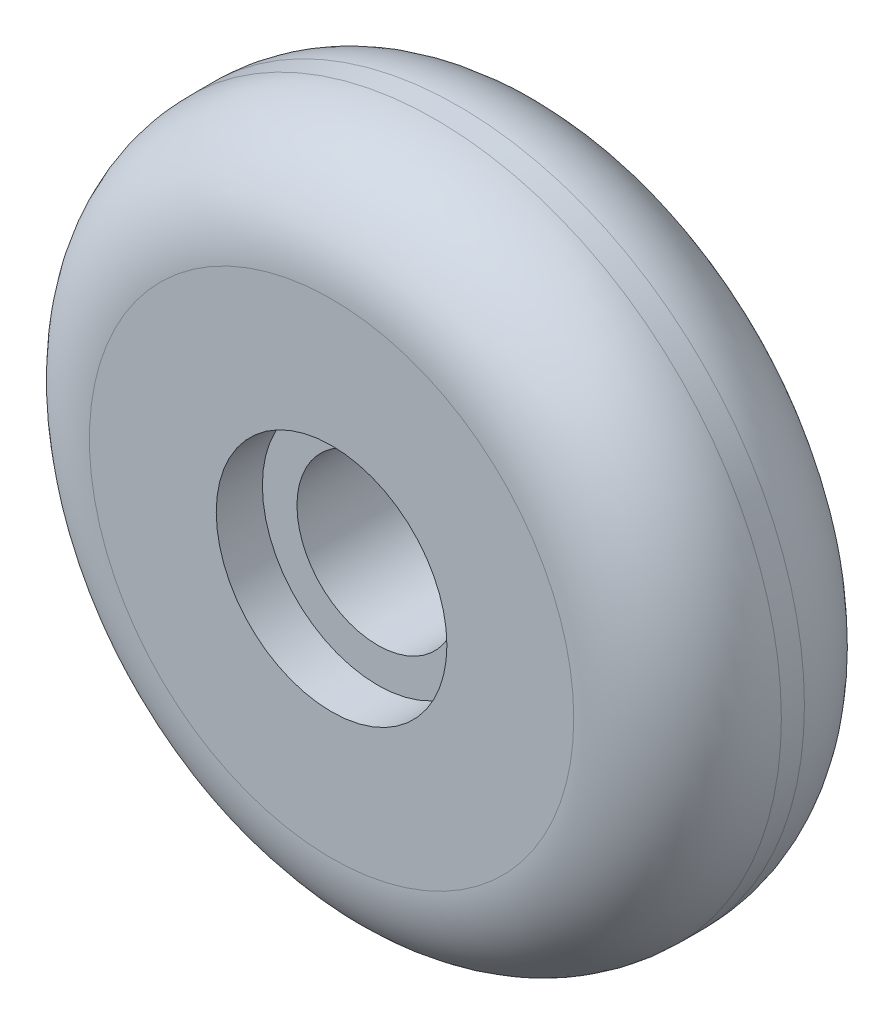
ISO-10303-21;
HEADER;
FILE_DESCRIPTION(('STEP AP214'),'2;1');
FILE_NAME('part.step','',(''),(''),'','','');
FILE_SCHEMA(('AUTOMOTIVE_DESIGN { 1 0 10303 214 1 1 1 1 }'));
ENDSEC;
DATA;
#1=APPLICATION_CONTEXT('core data for automotive mechanical design processes');
#2=APPLICATION_PROTOCOL_DEFINITION('international standard','automotive_design',2000,#1);
#3=PRODUCT_CONTEXT('',#1,'mechanical');
#4=PRODUCT('Part','Part','',(#3));
#5=PRODUCT_RELATED_PRODUCT_CATEGORY('part','',(#4));
#6=PRODUCT_DEFINITION_FORMATION('','',#4);
#7=PRODUCT_DEFINITION_CONTEXT('part definition',#1,'design');
#8=PRODUCT_DEFINITION('design','',#6,#7);
#9=PRODUCT_DEFINITION_SHAPE('','',#8);
#10=(LENGTH_UNIT() NAMED_UNIT(*) SI_UNIT(.MILLI.,.METRE.));
#11=(NAMED_UNIT(*) PLANE_ANGLE_UNIT() SI_UNIT($,.RADIAN.));
#12=(NAMED_UNIT(*) SI_UNIT($,.STERADIAN.) SOLID_ANGLE_UNIT());
#13=UNCERTAINTY_MEASURE_WITH_UNIT(LENGTH_MEASURE(1.E-05),#10,'distance_accuracy_value','');
#14=(GEOMETRIC_REPRESENTATION_CONTEXT(3) GLOBAL_UNCERTAINTY_ASSIGNED_CONTEXT((#13)) GLOBAL_UNIT_ASSIGNED_CONTEXT((#10,
#11,#12)) REPRESENTATION_CONTEXT('',''));
#15=CARTESIAN_POINT('',(0.,0.,0.));
#16=DIRECTION('',(0.,0.,1.));
#17=DIRECTION('',(1.,0.,0.));
#18=AXIS2_PLACEMENT_3D('',#15,#16,#17);
#19=CARTESIAN_POINT('',(0.,0.,10.));
#20=DIRECTION('',(0.,0.,-1.));
#21=DIRECTION('',(-1.,0.,0.));
#22=AXIS2_PLACEMENT_3D('',#19,#20,#21);
#23=CYLINDRICAL_SURFACE('',#22,3.5);
#24=CARTESIAN_POINT('',(0.,0.,2.));
#25=DIRECTION('',(0.,0.,-1.));
#26=DIRECTION('',(-1.,0.,0.));
#27=AXIS2_PLACEMENT_3D('',#24,#25,#26);
#28=CIRCLE('',#27,3.5);
#29=CARTESIAN_POINT('',(-3.5,0.,2.));
#30=VERTEX_POINT('',#29);
#31=EDGE_CURVE('E61',#30,#30,#28,.T.);
#32=ORIENTED_EDGE('',*,*,#31,.T.);
#33=EDGE_LOOP('',(#32));
#34=FACE_BOUND('',#33,.T.);
#35=CARTESIAN_POINT('',(0.,0.,8.));
#36=DIRECTION('',(0.,0.,1.));
#37=DIRECTION('',(1.,0.,0.));
#38=AXIS2_PLACEMENT_3D('',#35,#36,#37);
#39=CIRCLE('',#38,3.5);
#40=CARTESIAN_POINT('',(3.5,0.,8.));
#41=VERTEX_POINT('',#40);
#42=EDGE_CURVE('E47',#41,#41,#39,.T.);
#43=ORIENTED_EDGE('',*,*,#42,.T.);
#44=EDGE_LOOP('',(#43));
#45=FACE_BOUND('',#44,.T.);
#46=ADVANCED_FACE('F43',(#34,#45),#23,.F.);
#47=CARTESIAN_POINT('',(0.,0.,10.));
#48=DIRECTION('',(0.,0.,1.));
#49=DIRECTION('',(1.,0.,0.));
#50=AXIS2_PLACEMENT_3D('',#47,#48,#49);
#51=PLANE('',#50);
#52=CARTESIAN_POINT('',(0.,0.,10.));
#53=DIRECTION('',(0.,0.,1.));
#54=DIRECTION('',(1.,0.,0.));
#55=AXIS2_PLACEMENT_3D('',#52,#53,#54);
#56=CIRCLE('',#55,5.);
#57=CARTESIAN_POINT('',(5.,0.,10.));
#58=VERTEX_POINT('',#57);
#59=EDGE_CURVE('E81',#58,#58,#56,.T.);
#60=ORIENTED_EDGE('',*,*,#59,.F.);
#61=EDGE_LOOP('',(#60));
#62=FACE_BOUND('',#61,.T.);
#63=CARTESIAN_POINT('',(0.,0.,10.));
#64=DIRECTION('',(0.,0.,1.));
#65=DIRECTION('',(1.,0.,0.));
#66=AXIS2_PLACEMENT_3D('',#63,#64,#65);
#67=CIRCLE('',#66,10.5);
#68=CARTESIAN_POINT('',(10.5,0.,10.));
#69=VERTEX_POINT('',#68);
#70=EDGE_CURVE('E10',#69,#69,#67,.T.);
#71=ORIENTED_EDGE('',*,*,#70,.T.);
#72=EDGE_LOOP('',(#71));
#73=FACE_BOUND('',#72,.T.);
#74=ADVANCED_FACE('F103',(#62,#73),#51,.T.);
#75=CARTESIAN_POINT('',(0.,0.,0.));
#76=DIRECTION('',(0.,0.,1.));
#77=DIRECTION('',(1.,0.,0.));
#78=AXIS2_PLACEMENT_3D('',#75,#76,#77);
#79=PLANE('',#78);
#80=CARTESIAN_POINT('',(0.,0.,0.));
#81=DIRECTION('',(0.,0.,-1.));
#82=DIRECTION('',(-1.,0.,0.));
#83=AXIS2_PLACEMENT_3D('',#80,#81,#82);
#84=CIRCLE('',#83,5.);
#85=CARTESIAN_POINT('',(-5.,0.,0.));
#86=VERTEX_POINT('',#85);
#87=EDGE_CURVE('E73',#86,#86,#84,.T.);
#88=ORIENTED_EDGE('',*,*,#87,.F.);
#89=EDGE_LOOP('',(#88));
#90=FACE_BOUND('',#89,.T.);
#91=CARTESIAN_POINT('',(0.,0.,0.));
#92=DIRECTION('',(0.,0.,1.));
#93=DIRECTION('',(1.,0.,0.));
#94=AXIS2_PLACEMENT_3D('',#91,#92,#93);
#95=CIRCLE('',#94,10.5);
#96=CARTESIAN_POINT('',(10.5,0.,0.));
#97=VERTEX_POINT('',#96);
#98=EDGE_CURVE('E52',#97,#97,#95,.F.);
#99=ORIENTED_EDGE('',*,*,#98,.T.);
#100=EDGE_LOOP('',(#99));
#101=FACE_BOUND('',#100,.T.);
#102=ADVANCED_FACE('F99',(#90,#101),#79,.F.);
#103=CARTESIAN_POINT('',(0.,0.,10.));
#104=DIRECTION('',(0.,0.,-1.));
#105=DIRECTION('',(-1.,0.,0.));
#106=AXIS2_PLACEMENT_3D('',#103,#104,#105);
#107=CYLINDRICAL_SURFACE('',#106,15.);
#108=CARTESIAN_POINT('',(0.,0.,4.5));
#109=DIRECTION('',(0.,0.,1.));
#110=DIRECTION('',(1.,0.,0.));
#111=AXIS2_PLACEMENT_3D('',#108,#109,#110);
#112=CIRCLE('',#111,15.);
#113=CARTESIAN_POINT('',(15.,0.,4.5));
#114=VERTEX_POINT('',#113);
#115=EDGE_CURVE('E58',#114,#114,#112,.T.);
#116=ORIENTED_EDGE('',*,*,#115,.T.);
#117=EDGE_LOOP('',(#116));
#118=FACE_BOUND('',#117,.T.);
#119=CARTESIAN_POINT('',(0.,0.,5.5));
#120=DIRECTION('',(0.,0.,1.));
#121=DIRECTION('',(1.,0.,0.));
#122=AXIS2_PLACEMENT_3D('',#119,#120,#121);
#123=CIRCLE('',#122,15.);
#124=CARTESIAN_POINT('',(15.,0.,5.5));
#125=VERTEX_POINT('',#124);
#126=EDGE_CURVE('E64',#125,#125,#123,.F.);
#127=ORIENTED_EDGE('',*,*,#126,.T.);
#128=EDGE_LOOP('',(#127));
#129=FACE_BOUND('',#128,.T.);
#130=ADVANCED_FACE('F87',(#118,#129),#107,.T.);
#131=CARTESIAN_POINT('',(0.,0.,4.5));
#132=DIRECTION('',(0.,0.,1.));
#133=DIRECTION('',(1.,0.,0.));
#134=AXIS2_PLACEMENT_3D('',#131,#132,#133);
#135=TOROIDAL_SURFACE('',#134,10.5,4.5);
#136=ORIENTED_EDGE('',*,*,#98,.F.);
#137=EDGE_LOOP('',(#136));
#138=FACE_BOUND('',#137,.T.);
#139=ORIENTED_EDGE('',*,*,#115,.F.);
#140=EDGE_LOOP('',(#139));
#141=FACE_BOUND('',#140,.T.);
#142=ADVANCED_FACE('F90',(#138,#141),#135,.T.);
#143=CARTESIAN_POINT('',(0.,0.,5.5));
#144=DIRECTION('',(0.,0.,1.));
#145=DIRECTION('',(1.,0.,0.));
#146=AXIS2_PLACEMENT_3D('',#143,#144,#145);
#147=TOROIDAL_SURFACE('',#146,10.5,4.5);
#148=ORIENTED_EDGE('',*,*,#126,.F.);
#149=EDGE_LOOP('',(#148));
#150=FACE_BOUND('',#149,.T.);
#151=ORIENTED_EDGE('',*,*,#70,.F.);
#152=EDGE_LOOP('',(#151));
#153=FACE_BOUND('',#152,.T.);
#154=ADVANCED_FACE('F45',(#150,#153),#147,.T.);
#155=CARTESIAN_POINT('',(0.,0.,2.));
#156=DIRECTION('',(0.,0.,-1.));
#157=DIRECTION('',(-1.,0.,0.));
#158=AXIS2_PLACEMENT_3D('',#155,#156,#157);
#159=CYLINDRICAL_SURFACE('',#158,5.);
#160=CARTESIAN_POINT('',(0.,0.,2.));
#161=DIRECTION('',(0.,0.,-1.));
#162=DIRECTION('',(-1.,0.,0.));
#163=AXIS2_PLACEMENT_3D('',#160,#161,#162);
#164=CIRCLE('',#163,5.);
#165=CARTESIAN_POINT('',(-5.,0.,2.));
#166=VERTEX_POINT('',#165);
#167=EDGE_CURVE('E65',#166,#166,#164,.T.);
#168=ORIENTED_EDGE('',*,*,#167,.F.);
#169=EDGE_LOOP('',(#168));
#170=FACE_BOUND('',#169,.T.);
#171=ORIENTED_EDGE('',*,*,#87,.T.);
#172=EDGE_LOOP('',(#171));
#173=FACE_BOUND('',#172,.T.);
#174=ADVANCED_FACE('F97',(#170,#173),#159,.F.);
#175=CARTESIAN_POINT('',(0.,0.,2.));
#176=DIRECTION('',(0.,0.,-1.));
#177=DIRECTION('',(-1.,0.,0.));
#178=AXIS2_PLACEMENT_3D('',#175,#176,#177);
#179=PLANE('',#178);
#180=ORIENTED_EDGE('',*,*,#31,.F.);
#181=EDGE_LOOP('',(#180));
#182=FACE_BOUND('',#181,.T.);
#183=ORIENTED_EDGE('',*,*,#167,.T.);
#184=EDGE_LOOP('',(#183));
#185=FACE_BOUND('',#184,.T.);
#186=ADVANCED_FACE('F123',(#182,#185),#179,.T.);
#187=CARTESIAN_POINT('',(0.,0.,8.));
#188=DIRECTION('',(0.,0.,1.));
#189=DIRECTION('',(1.,0.,0.));
#190=AXIS2_PLACEMENT_3D('',#187,#188,#189);
#191=CYLINDRICAL_SURFACE('',#190,5.);
#192=CARTESIAN_POINT('',(0.,0.,8.));
#193=DIRECTION('',(0.,0.,1.));
#194=DIRECTION('',(1.,0.,0.));
#195=AXIS2_PLACEMENT_3D('',#192,#193,#194);
#196=CIRCLE('',#195,5.);
#197=CARTESIAN_POINT('',(5.,0.,8.));
#198=VERTEX_POINT('',#197);
#199=EDGE_CURVE('E145',#198,#198,#196,.T.);
#200=ORIENTED_EDGE('',*,*,#199,.F.);
#201=EDGE_LOOP('',(#200));
#202=FACE_BOUND('',#201,.T.);
#203=ORIENTED_EDGE('',*,*,#59,.T.);
#204=EDGE_LOOP('',(#203));
#205=FACE_BOUND('',#204,.T.);
#206=ADVANCED_FACE('F127',(#202,#205),#191,.F.);
#207=CARTESIAN_POINT('',(0.,0.,8.));
#208=DIRECTION('',(0.,0.,1.));
#209=DIRECTION('',(1.,0.,0.));
#210=AXIS2_PLACEMENT_3D('',#207,#208,#209);
#211=PLANE('',#210);
#212=ORIENTED_EDGE('',*,*,#42,.F.);
#213=EDGE_LOOP('',(#212));
#214=FACE_BOUND('',#213,.T.);
#215=ORIENTED_EDGE('',*,*,#199,.T.);
#216=EDGE_LOOP('',(#215));
#217=FACE_BOUND('',#216,.T.);
#218=ADVANCED_FACE('F132',(#214,#217),#211,.T.);
#219=CLOSED_SHELL('',(#46,#74,#102,#130,#142,#154,#174,#186,#206,#218));
#220=MANIFOLD_SOLID_BREP('B2',#219);
#221=ADVANCED_BREP_SHAPE_REPRESENTATION('',(#18,#220),#14);
#222=SHAPE_DEFINITION_REPRESENTATION(#9,#221);
ENDSEC;
END-ISO-10303-21;
